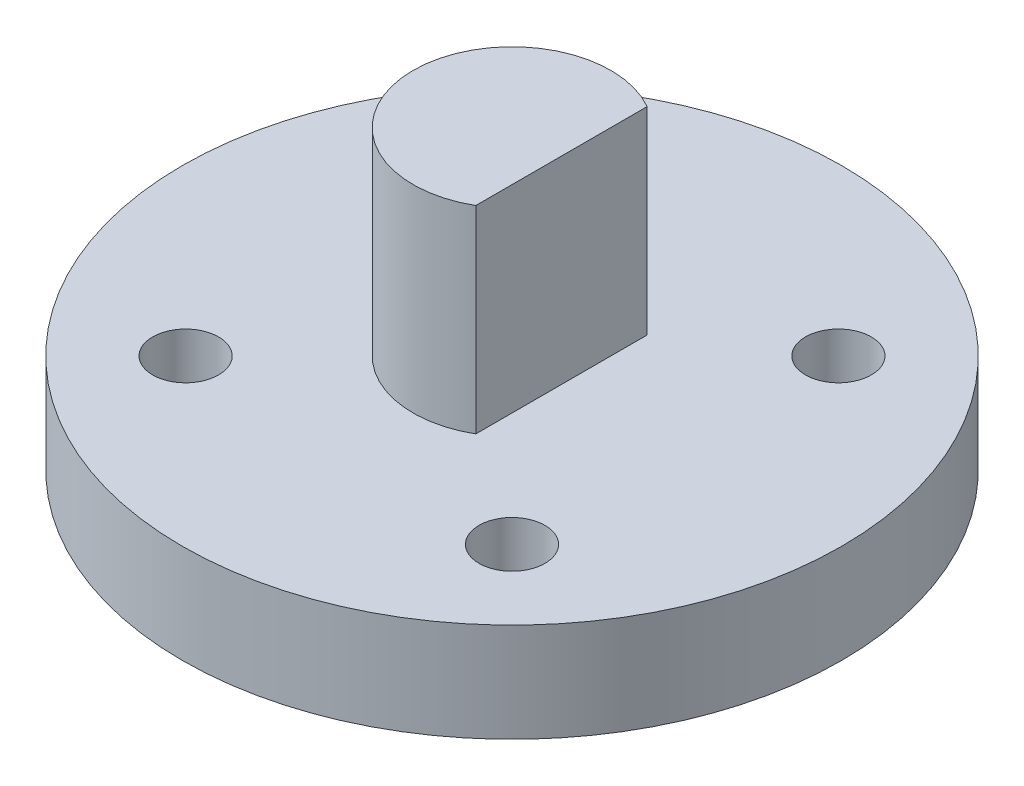
ISO-10303-21;
HEADER;
FILE_DESCRIPTION(('STEP AP214'),'2;1');
FILE_NAME('part.step','',(''),(''),'','','');
FILE_SCHEMA(('AUTOMOTIVE_DESIGN { 1 0 10303 214 1 1 1 1 }'));
ENDSEC;
DATA;
#1=APPLICATION_CONTEXT('core data for automotive mechanical design processes');
#2=APPLICATION_PROTOCOL_DEFINITION('international standard','automotive_design',2000,#1);
#3=PRODUCT_CONTEXT('',#1,'mechanical');
#4=PRODUCT('Part','Part','',(#3));
#5=PRODUCT_RELATED_PRODUCT_CATEGORY('part','',(#4));
#6=PRODUCT_DEFINITION_FORMATION('','',#4);
#7=PRODUCT_DEFINITION_CONTEXT('part definition',#1,'design');
#8=PRODUCT_DEFINITION('design','',#6,#7);
#9=PRODUCT_DEFINITION_SHAPE('','',#8);
#10=(LENGTH_UNIT() NAMED_UNIT(*) SI_UNIT(.MILLI.,.METRE.));
#11=(NAMED_UNIT(*) PLANE_ANGLE_UNIT() SI_UNIT($,.RADIAN.));
#12=(NAMED_UNIT(*) SI_UNIT($,.STERADIAN.) SOLID_ANGLE_UNIT());
#13=UNCERTAINTY_MEASURE_WITH_UNIT(LENGTH_MEASURE(1.E-05),#10,'distance_accuracy_value','');
#14=(GEOMETRIC_REPRESENTATION_CONTEXT(3) GLOBAL_UNCERTAINTY_ASSIGNED_CONTEXT((#13)) GLOBAL_UNIT_ASSIGNED_CONTEXT((#10,
#11,#12)) REPRESENTATION_CONTEXT('',''));
#15=CARTESIAN_POINT('',(0.,0.,0.));
#16=DIRECTION('',(0.,0.,1.));
#17=DIRECTION('',(1.,0.,0.));
#18=AXIS2_PLACEMENT_3D('',#15,#16,#17);
#19=CARTESIAN_POINT('',(-4.94974746830584,3.,-4.94974746830582));
#20=DIRECTION('',(0.,-1.,0.));
#21=DIRECTION('',(0.,0.,-1.));
#22=AXIS2_PLACEMENT_3D('',#19,#20,#21);
#23=CYLINDRICAL_SURFACE('',#22,1.);
#24=CARTESIAN_POINT('',(-4.94974746830584,3.,-4.94974746830582));
#25=DIRECTION('',(0.,1.,0.));
#26=DIRECTION('',(0.,0.,1.));
#27=AXIS2_PLACEMENT_3D('',#24,#25,#26);
#28=CIRCLE('',#27,1.);
#29=CARTESIAN_POINT('',(-4.94974746830584,3.,-3.94974746830582));
#30=VERTEX_POINT('',#29);
#31=EDGE_CURVE('E112',#30,#30,#28,.T.);
#32=ORIENTED_EDGE('',*,*,#31,.T.);
#33=EDGE_LOOP('',(#32));
#34=FACE_BOUND('',#33,.T.);
#35=CARTESIAN_POINT('',(-4.94974746830584,0.,-4.94974746830582));
#36=DIRECTION('',(0.,1.,0.));
#37=DIRECTION('',(0.,0.,1.));
#38=AXIS2_PLACEMENT_3D('',#35,#36,#37);
#39=CIRCLE('',#38,1.);
#40=CARTESIAN_POINT('',(-4.94974746830584,0.,-3.94974746830582));
#41=VERTEX_POINT('',#40);
#42=EDGE_CURVE('E123',#41,#41,#39,.T.);
#43=ORIENTED_EDGE('',*,*,#42,.F.);
#44=EDGE_LOOP('',(#43));
#45=FACE_BOUND('',#44,.T.);
#46=ADVANCED_FACE('F50',(#34,#45),#23,.F.);
#47=CARTESIAN_POINT('',(4.94974746830584,3.,-4.94974746830581));
#48=DIRECTION('',(0.,-1.,0.));
#49=DIRECTION('',(0.,0.,-1.));
#50=AXIS2_PLACEMENT_3D('',#47,#48,#49);
#51=CYLINDRICAL_SURFACE('',#50,1.);
#52=CARTESIAN_POINT('',(4.94974746830584,3.,-4.94974746830581));
#53=DIRECTION('',(0.,1.,0.));
#54=DIRECTION('',(0.,0.,1.));
#55=AXIS2_PLACEMENT_3D('',#52,#53,#54);
#56=CIRCLE('',#55,1.);
#57=CARTESIAN_POINT('',(4.94974746830584,3.,-3.94974746830581));
#58=VERTEX_POINT('',#57);
#59=EDGE_CURVE('E110',#58,#58,#56,.T.);
#60=ORIENTED_EDGE('',*,*,#59,.T.);
#61=EDGE_LOOP('',(#60));
#62=FACE_BOUND('',#61,.T.);
#63=CARTESIAN_POINT('',(4.94974746830584,0.,-4.94974746830581));
#64=DIRECTION('',(0.,1.,0.));
#65=DIRECTION('',(0.,0.,1.));
#66=AXIS2_PLACEMENT_3D('',#63,#64,#65);
#67=CIRCLE('',#66,1.);
#68=CARTESIAN_POINT('',(4.94974746830584,0.,-3.94974746830581));
#69=VERTEX_POINT('',#68);
#70=EDGE_CURVE('E121',#69,#69,#67,.T.);
#71=ORIENTED_EDGE('',*,*,#70,.F.);
#72=EDGE_LOOP('',(#71));
#73=FACE_BOUND('',#72,.T.);
#74=ADVANCED_FACE('F151',(#62,#73),#51,.F.);
#75=CARTESIAN_POINT('',(4.94974746830582,3.,4.94974746830587));
#76=DIRECTION('',(0.,-1.,0.));
#77=DIRECTION('',(0.,0.,-1.));
#78=AXIS2_PLACEMENT_3D('',#75,#76,#77);
#79=CYLINDRICAL_SURFACE('',#78,1.);
#80=CARTESIAN_POINT('',(4.94974746830582,3.,4.94974746830587));
#81=DIRECTION('',(0.,1.,0.));
#82=DIRECTION('',(0.,0.,1.));
#83=AXIS2_PLACEMENT_3D('',#80,#81,#82);
#84=CIRCLE('',#83,1.);
#85=CARTESIAN_POINT('',(4.94974746830582,3.,5.94974746830587));
#86=VERTEX_POINT('',#85);
#87=EDGE_CURVE('E103',#86,#86,#84,.T.);
#88=ORIENTED_EDGE('',*,*,#87,.T.);
#89=EDGE_LOOP('',(#88));
#90=FACE_BOUND('',#89,.T.);
#91=CARTESIAN_POINT('',(4.94974746830582,0.,4.94974746830587));
#92=DIRECTION('',(0.,1.,0.));
#93=DIRECTION('',(0.,0.,1.));
#94=AXIS2_PLACEMENT_3D('',#91,#92,#93);
#95=CIRCLE('',#94,1.);
#96=CARTESIAN_POINT('',(4.94974746830582,0.,5.94974746830587));
#97=VERTEX_POINT('',#96);
#98=EDGE_CURVE('E92',#97,#97,#95,.T.);
#99=ORIENTED_EDGE('',*,*,#98,.F.);
#100=EDGE_LOOP('',(#99));
#101=FACE_BOUND('',#100,.T.);
#102=ADVANCED_FACE('F160',(#90,#101),#79,.F.);
#103=CARTESIAN_POINT('',(-4.94974746830585,3.,4.94974746830587));
#104=DIRECTION('',(0.,-1.,0.));
#105=DIRECTION('',(0.,0.,-1.));
#106=AXIS2_PLACEMENT_3D('',#103,#104,#105);
#107=CYLINDRICAL_SURFACE('',#106,1.);
#108=CARTESIAN_POINT('',(-4.94974746830585,3.,4.94974746830587));
#109=DIRECTION('',(0.,1.,0.));
#110=DIRECTION('',(0.,0.,1.));
#111=AXIS2_PLACEMENT_3D('',#108,#109,#110);
#112=CIRCLE('',#111,1.);
#113=CARTESIAN_POINT('',(-4.94974746830585,3.,5.94974746830587));
#114=VERTEX_POINT('',#113);
#115=EDGE_CURVE('E97',#114,#114,#112,.T.);
#116=ORIENTED_EDGE('',*,*,#115,.T.);
#117=EDGE_LOOP('',(#116));
#118=FACE_BOUND('',#117,.T.);
#119=CARTESIAN_POINT('',(-4.94974746830585,0.,4.94974746830587));
#120=DIRECTION('',(0.,1.,0.));
#121=DIRECTION('',(0.,0.,1.));
#122=AXIS2_PLACEMENT_3D('',#119,#120,#121);
#123=CIRCLE('',#122,1.);
#124=CARTESIAN_POINT('',(-4.94974746830585,0.,5.94974746830587));
#125=VERTEX_POINT('',#124);
#126=EDGE_CURVE('E93',#125,#125,#123,.T.);
#127=ORIENTED_EDGE('',*,*,#126,.F.);
#128=EDGE_LOOP('',(#127));
#129=FACE_BOUND('',#128,.T.);
#130=ADVANCED_FACE('F47',(#118,#129),#107,.F.);
#131=CARTESIAN_POINT('',(0.,3.,0.));
#132=DIRECTION('',(0.,-1.,0.));
#133=DIRECTION('',(0.,0.,-1.));
#134=AXIS2_PLACEMENT_3D('',#131,#132,#133);
#135=CYLINDRICAL_SURFACE('',#134,10.);
#136=CARTESIAN_POINT('',(0.,3.,0.));
#137=DIRECTION('',(0.,1.,0.));
#138=DIRECTION('',(0.,0.,1.));
#139=AXIS2_PLACEMENT_3D('',#136,#137,#138);
#140=CIRCLE('',#139,10.);
#141=CARTESIAN_POINT('',(0.,3.,10.));
#142=VERTEX_POINT('',#141);
#143=EDGE_CURVE('E60',#142,#142,#140,.T.);
#144=ORIENTED_EDGE('',*,*,#143,.F.);
#145=EDGE_LOOP('',(#144));
#146=FACE_BOUND('',#145,.T.);
#147=CARTESIAN_POINT('',(0.,0.,0.));
#148=DIRECTION('',(0.,1.,0.));
#149=DIRECTION('',(0.,0.,1.));
#150=AXIS2_PLACEMENT_3D('',#147,#148,#149);
#151=CIRCLE('',#150,10.);
#152=CARTESIAN_POINT('',(0.,0.,10.));
#153=VERTEX_POINT('',#152);
#154=EDGE_CURVE('E51',#153,#153,#151,.T.);
#155=ORIENTED_EDGE('',*,*,#154,.T.);
#156=EDGE_LOOP('',(#155));
#157=FACE_BOUND('',#156,.T.);
#158=ADVANCED_FACE('F131',(#146,#157),#135,.T.);
#159=CARTESIAN_POINT('',(0.,3.,0.));
#160=DIRECTION('',(0.,1.,0.));
#161=DIRECTION('',(0.,0.,1.));
#162=AXIS2_PLACEMENT_3D('',#159,#160,#161);
#163=PLANE('',#162);
#164=CARTESIAN_POINT('',(0.,3.,0.));
#165=DIRECTION('',(0.,1.,0.));
#166=DIRECTION('',(0.,0.,1.));
#167=AXIS2_PLACEMENT_3D('',#164,#165,#166);
#168=CIRCLE('',#167,3.);
#169=CARTESIAN_POINT('',(1.5,3.,-2.59807621135332));
#170=VERTEX_POINT('',#169);
#171=CARTESIAN_POINT('',(1.5,3.,2.59807621135332));
#172=VERTEX_POINT('',#171);
#173=EDGE_CURVE('E11',#170,#172,#168,.T.);
#174=ORIENTED_EDGE('',*,*,#173,.F.);
#175=DIRECTION('',(0.,0.,1.));
#176=VECTOR('',#175,1.);
#177=CARTESIAN_POINT('',(1.5,3.,-2.59807621135332));
#178=LINE('',#177,#176);
#179=EDGE_CURVE('E81',#170,#172,#178,.T.);
#180=ORIENTED_EDGE('',*,*,#179,.T.);
#181=EDGE_LOOP('',(#174,#180));
#182=FACE_BOUND('',#181,.T.);
#183=ORIENTED_EDGE('',*,*,#115,.F.);
#184=EDGE_LOOP('',(#183));
#185=FACE_BOUND('',#184,.T.);
#186=ORIENTED_EDGE('',*,*,#87,.F.);
#187=EDGE_LOOP('',(#186));
#188=FACE_BOUND('',#187,.T.);
#189=ORIENTED_EDGE('',*,*,#59,.F.);
#190=EDGE_LOOP('',(#189));
#191=FACE_BOUND('',#190,.T.);
#192=ORIENTED_EDGE('',*,*,#31,.F.);
#193=EDGE_LOOP('',(#192));
#194=FACE_BOUND('',#193,.T.);
#195=ORIENTED_EDGE('',*,*,#143,.T.);
#196=EDGE_LOOP('',(#195));
#197=FACE_BOUND('',#196,.T.);
#198=ADVANCED_FACE('F140',(#182,#185,#188,#191,#194,#197),#163,.T.);
#199=CARTESIAN_POINT('',(0.,0.,0.));
#200=DIRECTION('',(0.,1.,0.));
#201=DIRECTION('',(0.,0.,1.));
#202=AXIS2_PLACEMENT_3D('',#199,#200,#201);
#203=PLANE('',#202);
#204=ORIENTED_EDGE('',*,*,#126,.T.);
#205=EDGE_LOOP('',(#204));
#206=FACE_BOUND('',#205,.T.);
#207=ORIENTED_EDGE('',*,*,#98,.T.);
#208=EDGE_LOOP('',(#207));
#209=FACE_BOUND('',#208,.T.);
#210=ORIENTED_EDGE('',*,*,#70,.T.);
#211=EDGE_LOOP('',(#210));
#212=FACE_BOUND('',#211,.T.);
#213=ORIENTED_EDGE('',*,*,#42,.T.);
#214=EDGE_LOOP('',(#213));
#215=FACE_BOUND('',#214,.T.);
#216=ORIENTED_EDGE('',*,*,#154,.F.);
#217=EDGE_LOOP('',(#216));
#218=FACE_BOUND('',#217,.T.);
#219=ADVANCED_FACE('F134',(#206,#209,#212,#215,#218),#203,.F.);
#220=CARTESIAN_POINT('',(0.,9.,0.));
#221=DIRECTION('',(0.,-1.,0.));
#222=DIRECTION('',(0.,0.,-1.));
#223=AXIS2_PLACEMENT_3D('',#220,#221,#222);
#224=CYLINDRICAL_SURFACE('',#223,3.);
#225=ORIENTED_EDGE('',*,*,#173,.T.);
#226=DIRECTION('',(0.,1.,0.));
#227=VECTOR('',#226,1.);
#228=CARTESIAN_POINT('',(1.5,3.,2.59807621135332));
#229=LINE('',#228,#227);
#230=CARTESIAN_POINT('',(1.5,9.,2.59807621135332));
#231=VERTEX_POINT('',#230);
#232=EDGE_CURVE('E72',#172,#231,#229,.T.);
#233=ORIENTED_EDGE('',*,*,#232,.T.);
#234=CARTESIAN_POINT('',(0.,9.,0.));
#235=DIRECTION('',(0.,1.,0.));
#236=DIRECTION('',(0.,0.,1.));
#237=AXIS2_PLACEMENT_3D('',#234,#235,#236);
#238=CIRCLE('',#237,3.);
#239=CARTESIAN_POINT('',(1.5,9.,-2.59807621135332));
#240=VERTEX_POINT('',#239);
#241=EDGE_CURVE('E84',#240,#231,#238,.T.);
#242=ORIENTED_EDGE('',*,*,#241,.F.);
#243=DIRECTION('',(0.,1.,0.));
#244=VECTOR('',#243,1.);
#245=CARTESIAN_POINT('',(1.5,3.,-2.59807621135332));
#246=LINE('',#245,#244);
#247=EDGE_CURVE('E64',#170,#240,#246,.T.);
#248=ORIENTED_EDGE('',*,*,#247,.F.);
#249=EDGE_LOOP('',(#225,#233,#242,#248));
#250=FACE_BOUND('',#249,.T.);
#251=ADVANCED_FACE('F83',(#250),#224,.T.);
#252=CARTESIAN_POINT('',(0.,9.,0.));
#253=DIRECTION('',(0.,1.,0.));
#254=DIRECTION('',(0.,0.,1.));
#255=AXIS2_PLACEMENT_3D('',#252,#253,#254);
#256=PLANE('',#255);
#257=DIRECTION('',(0.,0.,1.));
#258=VECTOR('',#257,1.);
#259=CARTESIAN_POINT('',(1.5,9.,-2.59807621135332));
#260=LINE('',#259,#258);
#261=EDGE_CURVE('E73',#240,#231,#260,.T.);
#262=ORIENTED_EDGE('',*,*,#261,.F.);
#263=ORIENTED_EDGE('',*,*,#241,.T.);
#264=EDGE_LOOP('',(#262,#263));
#265=FACE_BOUND('',#264,.T.);
#266=ADVANCED_FACE('F90',(#265),#256,.T.);
#267=CARTESIAN_POINT('',(1.5,3.,-2.59807621135332));
#268=DIRECTION('',(-1.,0.,0.));
#269=DIRECTION('',(0.,0.,1.));
#270=AXIS2_PLACEMENT_3D('',#267,#268,#269);
#271=PLANE('',#270);
#272=ORIENTED_EDGE('',*,*,#261,.T.);
#273=ORIENTED_EDGE('',*,*,#232,.F.);
#274=ORIENTED_EDGE('',*,*,#179,.F.);
#275=ORIENTED_EDGE('',*,*,#247,.T.);
#276=EDGE_LOOP('',(#272,#273,#274,#275));
#277=FACE_BOUND('',#276,.T.);
#278=ADVANCED_FACE('F78',(#277),#271,.F.);
#279=CLOSED_SHELL('',(#46,#74,#102,#130,#158,#198,#219,#251,#266,#278));
#280=MANIFOLD_SOLID_BREP('B2',#279);
#281=ADVANCED_BREP_SHAPE_REPRESENTATION('',(#18,#280),#14);
#282=SHAPE_DEFINITION_REPRESENTATION(#9,#281);
ENDSEC;
END-ISO-10303-21;
